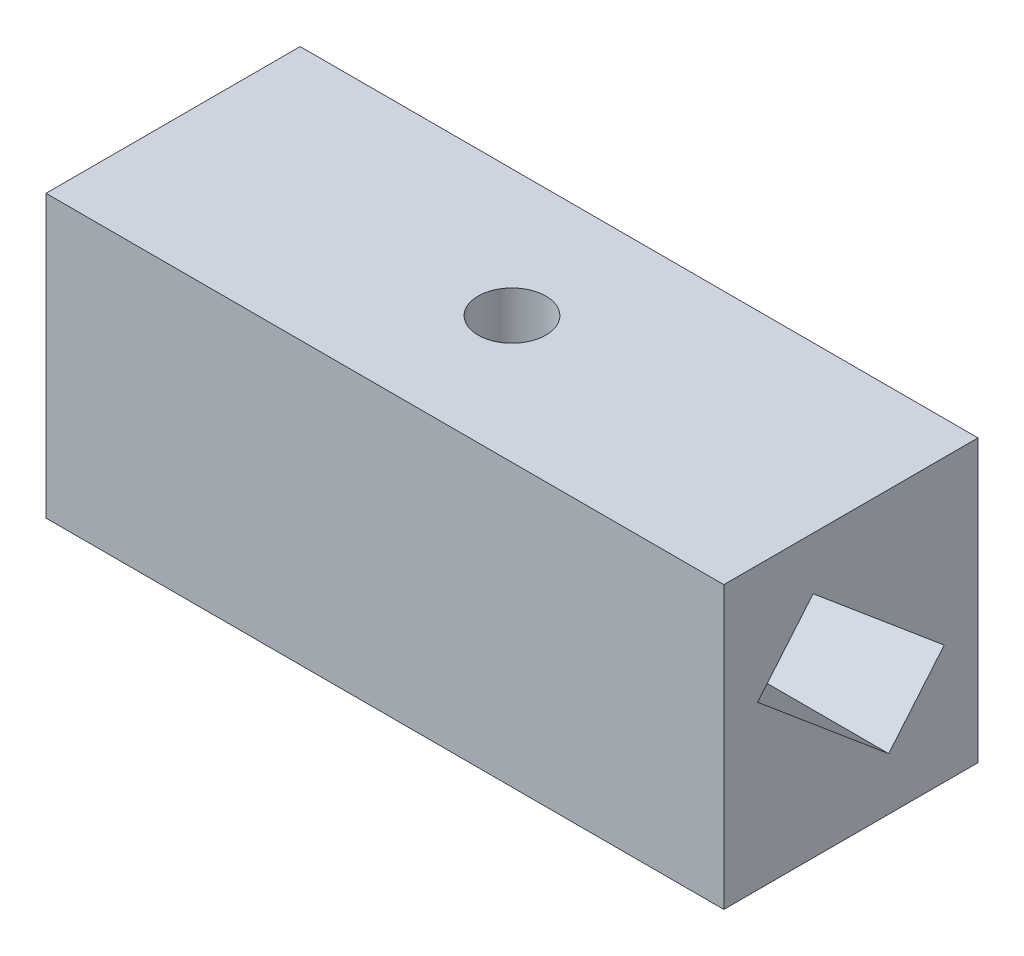
ISO-10303-21;
HEADER;
FILE_DESCRIPTION(('STEP AP214'),'2;1');
FILE_NAME('part.step','',(''),(''),'','','');
FILE_SCHEMA(('AUTOMOTIVE_DESIGN { 1 0 10303 214 1 1 1 1 }'));
ENDSEC;
DATA;
#1=APPLICATION_CONTEXT('core data for automotive mechanical design processes');
#2=APPLICATION_PROTOCOL_DEFINITION('international standard','automotive_design',2000,#1);
#3=PRODUCT_CONTEXT('',#1,'mechanical');
#4=PRODUCT('Part','Part','',(#3));
#5=PRODUCT_RELATED_PRODUCT_CATEGORY('part','',(#4));
#6=PRODUCT_DEFINITION_FORMATION('','',#4);
#7=PRODUCT_DEFINITION_CONTEXT('part definition',#1,'design');
#8=PRODUCT_DEFINITION('design','',#6,#7);
#9=PRODUCT_DEFINITION_SHAPE('','',#8);
#10=(LENGTH_UNIT() NAMED_UNIT(*) SI_UNIT(.MILLI.,.METRE.));
#11=(NAMED_UNIT(*) PLANE_ANGLE_UNIT() SI_UNIT($,.RADIAN.));
#12=(NAMED_UNIT(*) SI_UNIT($,.STERADIAN.) SOLID_ANGLE_UNIT());
#13=UNCERTAINTY_MEASURE_WITH_UNIT(LENGTH_MEASURE(1.E-05),#10,'distance_accuracy_value','');
#14=(GEOMETRIC_REPRESENTATION_CONTEXT(3) GLOBAL_UNCERTAINTY_ASSIGNED_CONTEXT((#13)) GLOBAL_UNIT_ASSIGNED_CONTEXT((#10,
#11,#12)) REPRESENTATION_CONTEXT('',''));
#15=CARTESIAN_POINT('',(0.,0.,0.));
#16=DIRECTION('',(0.,0.,1.));
#17=DIRECTION('',(1.,0.,0.));
#18=AXIS2_PLACEMENT_3D('',#15,#16,#17);
#19=CARTESIAN_POINT('',(40.,33.2,15.));
#20=DIRECTION('',(-1.,0.,0.));
#21=DIRECTION('',(0.,0.,1.));
#22=AXIS2_PLACEMENT_3D('',#19,#20,#21);
#23=PLANE('',#22);
#24=DIRECTION('',(0.,0.766044443118982,-0.642787609686534));
#25=VECTOR('',#24,1.);
#26=CARTESIAN_POINT('',(40.,14.0146718020728,-11.015265684903));
#27=LINE('',#26,#25);
#28=CARTESIAN_POINT('',(40.,6.20101848225919,-4.45883206610039));
#29=VERTEX_POINT('',#28);
#30=CARTESIAN_POINT('',(40.,14.0146718020728,-11.015265684903));
#31=VERTEX_POINT('',#30);
#32=EDGE_CURVE('E151',#29,#31,#27,.T.);
#33=ORIENTED_EDGE('',*,*,#32,.F.);
#34=DIRECTION('',(0.,-0.642787609686535,-0.766044443118982));
#35=VECTOR('',#34,1.);
#36=CARTESIAN_POINT('',(40.,6.20101848225919,-4.45883206610039));
#37=LINE('',#36,#35);
#38=CARTESIAN_POINT('',(40.,19.1853281979272,11.015265684903));
#39=VERTEX_POINT('',#38);
#40=EDGE_CURVE('E48',#39,#29,#37,.T.);
#41=ORIENTED_EDGE('',*,*,#40,.F.);
#42=DIRECTION('',(0.,-0.766044443118982,0.642787609686534));
#43=VECTOR('',#42,1.);
#44=CARTESIAN_POINT('',(40.,26.9989815177408,4.45883206610039));
#45=LINE('',#44,#43);
#46=CARTESIAN_POINT('',(40.,26.9989815177408,4.45883206610039));
#47=VERTEX_POINT('',#46);
#48=EDGE_CURVE('E142',#47,#39,#45,.T.);
#49=ORIENTED_EDGE('',*,*,#48,.F.);
#50=DIRECTION('',(0.,0.642787609686535,0.766044443118982));
#51=VECTOR('',#50,1.);
#52=CARTESIAN_POINT('',(40.,14.0146718020728,-11.015265684903));
#53=LINE('',#52,#51);
#54=EDGE_CURVE('E145',#31,#47,#53,.T.);
#55=ORIENTED_EDGE('',*,*,#54,.F.);
#56=EDGE_LOOP('',(#33,#41,#49,#55));
#57=FACE_BOUND('',#56,.T.);
#58=DIRECTION('',(0.,0.,-1.));
#59=VECTOR('',#58,1.);
#60=CARTESIAN_POINT('',(40.,0.,15.));
#61=LINE('',#60,#59);
#62=CARTESIAN_POINT('',(40.,0.,15.));
#63=VERTEX_POINT('',#62);
#64=CARTESIAN_POINT('',(40.,0.,-15.));
#65=VERTEX_POINT('',#64);
#66=EDGE_CURVE('E194',#63,#65,#61,.T.);
#67=ORIENTED_EDGE('',*,*,#66,.T.);
#68=DIRECTION('',(0.,-1.,0.));
#69=VECTOR('',#68,1.);
#70=CARTESIAN_POINT('',(40.,33.2,-15.));
#71=LINE('',#70,#69);
#72=CARTESIAN_POINT('',(40.,33.2,-15.));
#73=VERTEX_POINT('',#72);
#74=EDGE_CURVE('E11',#73,#65,#71,.T.);
#75=ORIENTED_EDGE('',*,*,#74,.F.);
#76=DIRECTION('',(0.,0.,-1.));
#77=VECTOR('',#76,1.);
#78=CARTESIAN_POINT('',(40.,33.2,15.));
#79=LINE('',#78,#77);
#80=CARTESIAN_POINT('',(40.,33.2,15.));
#81=VERTEX_POINT('',#80);
#82=EDGE_CURVE('E197',#81,#73,#79,.T.);
#83=ORIENTED_EDGE('',*,*,#82,.F.);
#84=DIRECTION('',(0.,-1.,0.));
#85=VECTOR('',#84,1.);
#86=CARTESIAN_POINT('',(40.,33.2,15.));
#87=LINE('',#86,#85);
#88=EDGE_CURVE('E207',#81,#63,#87,.T.);
#89=ORIENTED_EDGE('',*,*,#88,.T.);
#90=EDGE_LOOP('',(#67,#75,#83,#89));
#91=FACE_BOUND('',#90,.T.);
#92=ADVANCED_FACE('F34',(#57,#91),#23,.F.);
#93=CARTESIAN_POINT('',(-40.,33.2,-15.));
#94=DIRECTION('',(0.,0.,1.));
#95=DIRECTION('',(1.,0.,0.));
#96=AXIS2_PLACEMENT_3D('',#93,#94,#95);
#97=PLANE('',#96);
#98=DIRECTION('',(-1.,0.,0.));
#99=VECTOR('',#98,1.);
#100=CARTESIAN_POINT('',(-40.,0.,-15.));
#101=LINE('',#100,#99);
#102=CARTESIAN_POINT('',(-40.,0.,-15.));
#103=VERTEX_POINT('',#102);
#104=EDGE_CURVE('E210',#65,#103,#101,.T.);
#105=ORIENTED_EDGE('',*,*,#104,.T.);
#106=DIRECTION('',(0.,-1.,0.));
#107=VECTOR('',#106,1.);
#108=CARTESIAN_POINT('',(-40.,33.2,-15.));
#109=LINE('',#108,#107);
#110=CARTESIAN_POINT('',(-40.,33.2,-15.));
#111=VERTEX_POINT('',#110);
#112=EDGE_CURVE('E41',#111,#103,#109,.T.);
#113=ORIENTED_EDGE('',*,*,#112,.F.);
#114=DIRECTION('',(-1.,0.,0.));
#115=VECTOR('',#114,1.);
#116=CARTESIAN_POINT('',(-40.,33.2,-15.));
#117=LINE('',#116,#115);
#118=EDGE_CURVE('E200',#73,#111,#117,.T.);
#119=ORIENTED_EDGE('',*,*,#118,.F.);
#120=ORIENTED_EDGE('',*,*,#74,.T.);
#121=EDGE_LOOP('',(#105,#113,#119,#120));
#122=FACE_BOUND('',#121,.T.);
#123=ADVANCED_FACE('F240',(#122),#97,.F.);
#124=CARTESIAN_POINT('',(-40.,33.2,15.));
#125=DIRECTION('',(1.,0.,0.));
#126=DIRECTION('',(0.,0.,-1.));
#127=AXIS2_PLACEMENT_3D('',#124,#125,#126);
#128=PLANE('',#127);
#129=DIRECTION('',(0.,0.766044443118977,-0.642787609686541));
#130=VECTOR('',#129,1.);
#131=CARTESIAN_POINT('',(-40.,26.9989815177408,4.4588320661003));
#132=LINE('',#131,#130);
#133=CARTESIAN_POINT('',(-40.,19.1853281979273,11.015265684903));
#134=VERTEX_POINT('',#133);
#135=CARTESIAN_POINT('',(-40.,26.9989815177408,4.4588320661003));
#136=VERTEX_POINT('',#135);
#137=EDGE_CURVE('E175',#134,#136,#132,.T.);
#138=ORIENTED_EDGE('',*,*,#137,.F.);
#139=DIRECTION('',(0.,0.642787609686541,0.766044443118977));
#140=VECTOR('',#139,1.);
#141=CARTESIAN_POINT('',(-40.,6.20101848225915,-4.45883206610031));
#142=LINE('',#141,#140);
#143=CARTESIAN_POINT('',(-40.,6.20101848225915,-4.45883206610031));
#144=VERTEX_POINT('',#143);
#145=EDGE_CURVE('E56',#144,#134,#142,.T.);
#146=ORIENTED_EDGE('',*,*,#145,.F.);
#147=DIRECTION('',(0.,-0.766044443118977,0.642787609686541));
#148=VECTOR('',#147,1.);
#149=CARTESIAN_POINT('',(-40.,14.0146718020727,-11.015265684903));
#150=LINE('',#149,#148);
#151=CARTESIAN_POINT('',(-40.,14.0146718020727,-11.015265684903));
#152=VERTEX_POINT('',#151);
#153=EDGE_CURVE('E164',#152,#144,#150,.T.);
#154=ORIENTED_EDGE('',*,*,#153,.F.);
#155=DIRECTION('',(0.,-0.642787609686541,-0.766044443118977));
#156=VECTOR('',#155,1.);
#157=CARTESIAN_POINT('',(-40.,14.0146718020727,-11.015265684903));
#158=LINE('',#157,#156);
#159=EDGE_CURVE('E178',#136,#152,#158,.T.);
#160=ORIENTED_EDGE('',*,*,#159,.F.);
#161=EDGE_LOOP('',(#138,#146,#154,#160));
#162=FACE_BOUND('',#161,.T.);
#163=DIRECTION('',(0.,0.,1.));
#164=VECTOR('',#163,1.);
#165=CARTESIAN_POINT('',(-40.,0.,15.));
#166=LINE('',#165,#164);
#167=CARTESIAN_POINT('',(-40.,0.,15.));
#168=VERTEX_POINT('',#167);
#169=EDGE_CURVE('E212',#103,#168,#166,.T.);
#170=ORIENTED_EDGE('',*,*,#169,.T.);
#171=DIRECTION('',(0.,-1.,0.));
#172=VECTOR('',#171,1.);
#173=CARTESIAN_POINT('',(-40.,33.2,15.));
#174=LINE('',#173,#172);
#175=CARTESIAN_POINT('',(-40.,33.2,15.));
#176=VERTEX_POINT('',#175);
#177=EDGE_CURVE('E217',#176,#168,#174,.T.);
#178=ORIENTED_EDGE('',*,*,#177,.F.);
#179=DIRECTION('',(0.,0.,1.));
#180=VECTOR('',#179,1.);
#181=CARTESIAN_POINT('',(-40.,33.2,15.));
#182=LINE('',#181,#180);
#183=EDGE_CURVE('E203',#111,#176,#182,.T.);
#184=ORIENTED_EDGE('',*,*,#183,.F.);
#185=ORIENTED_EDGE('',*,*,#112,.T.);
#186=EDGE_LOOP('',(#170,#178,#184,#185));
#187=FACE_BOUND('',#186,.T.);
#188=ADVANCED_FACE('F224',(#162,#187),#128,.F.);
#189=CARTESIAN_POINT('',(-40.,33.2,15.));
#190=DIRECTION('',(0.,0.,-1.));
#191=DIRECTION('',(-1.,0.,0.));
#192=AXIS2_PLACEMENT_3D('',#189,#190,#191);
#193=PLANE('',#192);
#194=DIRECTION('',(1.,0.,0.));
#195=VECTOR('',#194,1.);
#196=CARTESIAN_POINT('',(-40.,0.,15.));
#197=LINE('',#196,#195);
#198=EDGE_CURVE('E201',#168,#63,#197,.T.);
#199=ORIENTED_EDGE('',*,*,#198,.T.);
#200=ORIENTED_EDGE('',*,*,#88,.F.);
#201=DIRECTION('',(1.,0.,0.));
#202=VECTOR('',#201,1.);
#203=CARTESIAN_POINT('',(-40.,33.2,15.));
#204=LINE('',#203,#202);
#205=EDGE_CURVE('E205',#176,#81,#204,.T.);
#206=ORIENTED_EDGE('',*,*,#205,.F.);
#207=ORIENTED_EDGE('',*,*,#177,.T.);
#208=EDGE_LOOP('',(#199,#200,#206,#207));
#209=FACE_BOUND('',#208,.T.);
#210=ADVANCED_FACE('F233',(#209),#193,.F.);
#211=CARTESIAN_POINT('',(0.,33.2,0.));
#212=DIRECTION('',(0.,-1.,0.));
#213=DIRECTION('',(0.,0.,-1.));
#214=AXIS2_PLACEMENT_3D('',#211,#212,#213);
#215=PLANE('',#214);
#216=CARTESIAN_POINT('',(0.,33.2,0.));
#217=DIRECTION('',(0.,1.,0.));
#218=DIRECTION('',(0.,0.,1.));
#219=AXIS2_PLACEMENT_3D('',#216,#217,#218);
#220=CIRCLE('',#219,4.);
#221=CARTESIAN_POINT('',(0.,33.2,4.));
#222=VERTEX_POINT('',#221);
#223=EDGE_CURVE('E185',#222,#222,#220,.T.);
#224=ORIENTED_EDGE('',*,*,#223,.F.);
#225=EDGE_LOOP('',(#224));
#226=FACE_BOUND('',#225,.T.);
#227=ORIENTED_EDGE('',*,*,#82,.T.);
#228=ORIENTED_EDGE('',*,*,#118,.T.);
#229=ORIENTED_EDGE('',*,*,#183,.T.);
#230=ORIENTED_EDGE('',*,*,#205,.T.);
#231=EDGE_LOOP('',(#227,#228,#229,#230));
#232=FACE_BOUND('',#231,.T.);
#233=ADVANCED_FACE('F239',(#226,#232),#215,.F.);
#234=CARTESIAN_POINT('',(0.,0.,0.));
#235=DIRECTION('',(0.,-1.,0.));
#236=DIRECTION('',(0.,0.,-1.));
#237=AXIS2_PLACEMENT_3D('',#234,#235,#236);
#238=PLANE('',#237);
#239=CARTESIAN_POINT('',(0.,0.,0.));
#240=DIRECTION('',(0.,1.,0.));
#241=DIRECTION('',(0.,0.,1.));
#242=AXIS2_PLACEMENT_3D('',#239,#240,#241);
#243=CIRCLE('',#242,4.);
#244=CARTESIAN_POINT('',(0.,0.,4.));
#245=VERTEX_POINT('',#244);
#246=EDGE_CURVE('E191',#245,#245,#243,.T.);
#247=ORIENTED_EDGE('',*,*,#246,.T.);
#248=EDGE_LOOP('',(#247));
#249=FACE_BOUND('',#248,.T.);
#250=ORIENTED_EDGE('',*,*,#66,.F.);
#251=ORIENTED_EDGE('',*,*,#198,.F.);
#252=ORIENTED_EDGE('',*,*,#169,.F.);
#253=ORIENTED_EDGE('',*,*,#104,.F.);
#254=EDGE_LOOP('',(#250,#251,#252,#253));
#255=FACE_BOUND('',#254,.T.);
#256=ADVANCED_FACE('F230',(#249,#255),#238,.T.);
#257=CARTESIAN_POINT('',(0.,0.,0.));
#258=DIRECTION('',(0.,1.,0.));
#259=DIRECTION('',(0.,0.,1.));
#260=AXIS2_PLACEMENT_3D('',#257,#258,#259);
#261=CYLINDRICAL_SURFACE('',#260,4.);
#262=CARTESIAN_POINT('',(0.,0.,4.));
#263=CARTESIAN_POINT('',(0.,0.345833333333333,4.));
#264=CARTESIAN_POINT('',(0.,0.691666666666667,4.));
#265=CARTESIAN_POINT('',(0.,1.38333333333333,4.));
#266=CARTESIAN_POINT('',(0.,1.72916666666667,4.));
#267=CARTESIAN_POINT('',(0.,2.42083333333333,4.));
#268=CARTESIAN_POINT('',(0.,2.76666666666667,4.));
#269=CARTESIAN_POINT('',(0.,3.45833333333333,4.));
#270=CARTESIAN_POINT('',(0.,3.80416666666667,4.));
#271=CARTESIAN_POINT('',(0.,4.49583333333333,4.));
#272=CARTESIAN_POINT('',(0.,4.84166666666667,4.));
#273=CARTESIAN_POINT('',(0.,5.53333333333333,4.));
#274=CARTESIAN_POINT('',(0.,5.87916666666667,4.));
#275=CARTESIAN_POINT('',(0.,6.57083333333333,4.));
#276=CARTESIAN_POINT('',(0.,6.91666666666667,4.));
#277=CARTESIAN_POINT('',(0.,7.60833333333333,4.));
#278=CARTESIAN_POINT('',(0.,7.95416666666667,4.));
#279=CARTESIAN_POINT('',(0.,8.64583333333333,4.));
#280=CARTESIAN_POINT('',(0.,8.99166666666667,4.));
#281=CARTESIAN_POINT('',(0.,9.68333333333333,4.));
#282=CARTESIAN_POINT('',(0.,10.0291666666667,4.));
#283=CARTESIAN_POINT('',(0.,10.7208333333333,4.));
#284=CARTESIAN_POINT('',(0.,11.0666666666667,4.));
#285=CARTESIAN_POINT('',(0.,11.7583333333333,4.));
#286=CARTESIAN_POINT('',(0.,12.1041666666667,4.));
#287=CARTESIAN_POINT('',(0.,12.7958333333333,4.));
#288=CARTESIAN_POINT('',(0.,13.1416666666667,4.));
#289=CARTESIAN_POINT('',(0.,13.8333333333333,4.));
#290=CARTESIAN_POINT('',(0.,14.1791666666667,4.));
#291=CARTESIAN_POINT('',(0.,14.8708333333333,4.));
#292=CARTESIAN_POINT('',(0.,15.2166666666667,4.));
#293=CARTESIAN_POINT('',(0.,15.9083333333333,4.));
#294=CARTESIAN_POINT('',(0.,16.2541666666667,4.));
#295=CARTESIAN_POINT('',(0.,16.9458333333333,4.));
#296=CARTESIAN_POINT('',(0.,17.2916666666667,4.));
#297=CARTESIAN_POINT('',(0.,17.9833333333333,4.));
#298=CARTESIAN_POINT('',(0.,18.3291666666667,4.));
#299=CARTESIAN_POINT('',(0.,19.0208333333333,4.));
#300=CARTESIAN_POINT('',(0.,19.3666666666667,4.));
#301=CARTESIAN_POINT('',(0.,20.0583333333333,4.));
#302=CARTESIAN_POINT('',(0.,20.4041666666667,4.));
#303=CARTESIAN_POINT('',(0.,21.0958333333333,4.));
#304=CARTESIAN_POINT('',(0.,21.4416666666667,4.));
#305=CARTESIAN_POINT('',(0.,22.1333333333333,4.));
#306=CARTESIAN_POINT('',(0.,22.4791666666667,4.));
#307=CARTESIAN_POINT('',(0.,23.1708333333333,4.));
#308=CARTESIAN_POINT('',(0.,23.5166666666667,4.));
#309=CARTESIAN_POINT('',(0.,24.2083333333333,4.));
#310=CARTESIAN_POINT('',(0.,24.5541666666667,4.));
#311=CARTESIAN_POINT('',(0.,25.2458333333333,4.));
#312=CARTESIAN_POINT('',(0.,25.5916666666667,4.));
#313=CARTESIAN_POINT('',(0.,26.2833333333333,4.));
#314=CARTESIAN_POINT('',(0.,26.6291666666667,4.));
#315=CARTESIAN_POINT('',(0.,27.3208333333333,4.));
#316=CARTESIAN_POINT('',(0.,27.6666666666667,4.));
#317=CARTESIAN_POINT('',(0.,28.3583333333333,4.));
#318=CARTESIAN_POINT('',(0.,28.7041666666667,4.));
#319=CARTESIAN_POINT('',(0.,29.3958333333333,4.));
#320=CARTESIAN_POINT('',(0.,29.7416666666667,4.));
#321=CARTESIAN_POINT('',(0.,30.4333333333333,4.));
#322=CARTESIAN_POINT('',(0.,30.7791666666667,4.));
#323=CARTESIAN_POINT('',(0.,31.4708333333333,4.));
#324=CARTESIAN_POINT('',(0.,31.8166666666667,4.));
#325=CARTESIAN_POINT('',(0.,32.5083333333333,4.));
#326=CARTESIAN_POINT('',(0.,32.8541666666667,4.));
#327=CARTESIAN_POINT('',(0.,33.2,4.));
#328=B_SPLINE_CURVE_WITH_KNOTS('',3,(#262,#263,#264,#265,#266,#267,#268,#269,#270,#271,#272,
#273,#274,#275,#276,#277,#278,#279,#280,#281,#282,#283,#284,#285,#286,#287,#288,#289,#290,#291,
#292,#293,#294,#295,#296,#297,#298,#299,#300,#301,#302,#303,#304,#305,#306,#307,#308,#309,#310,
#311,#312,#313,#314,#315,#316,#317,#318,#319,#320,#321,#322,#323,#324,#325,#326,#327),
.UNSPECIFIED.,.F.,.F.,(4,2,2,2,2,2,2,2,2,2,2,2,2,2,2,2,2,2,2,2,2,2,2,2,2,2,2,2,2,2,2,2,4),(0.,
1.0375,2.075,3.1125,4.15,5.1875,6.225,7.2625,8.3,9.3375,10.375,11.4125,12.45,13.4875,14.525,
15.5625,16.6,17.6375,18.675,19.7125,20.75,21.7875,22.825,23.8625,24.9,25.9375,26.975,28.0125,
29.05,30.0875,31.125,32.1625,33.2),.UNSPECIFIED.);
#329=EDGE_CURVE('BSEAM254',#245,#222,#328,.T.);
#330=ORIENTED_EDGE('',*,*,#246,.F.);
#331=ORIENTED_EDGE('',*,*,#223,.T.);
#332=ORIENTED_EDGE('',*,*,#329,.T.);
#333=ORIENTED_EDGE('',*,*,#329,.F.);
#334=EDGE_LOOP('',(#330,#332,#331,#333));
#335=FACE_BOUND('',#334,.T.);
#336=ADVANCED_FACE('F254',(#335),#261,.F.);
#337=CARTESIAN_POINT('',(-10.,6.20101848225915,-4.45883206610031));
#338=DIRECTION('',(0.,-0.766044443118977,0.642787609686541));
#339=DIRECTION('',(0.,-0.642787609686541,-0.766044443118977));
#340=AXIS2_PLACEMENT_3D('',#337,#338,#339);
#341=PLANE('',#340);
#342=ORIENTED_EDGE('',*,*,#145,.T.);
#343=DIRECTION('',(-1.,0.,0.));
#344=VECTOR('',#343,1.);
#345=CARTESIAN_POINT('',(-10.,19.1853281979273,11.015265684903));
#346=LINE('',#345,#344);
#347=CARTESIAN_POINT('',(-10.,19.1853281979273,11.015265684903));
#348=VERTEX_POINT('',#347);
#349=EDGE_CURVE('E173',#348,#134,#346,.T.);
#350=ORIENTED_EDGE('',*,*,#349,.F.);
#351=DIRECTION('',(0.,0.642787609686541,0.766044443118977));
#352=VECTOR('',#351,1.);
#353=CARTESIAN_POINT('',(-10.,6.20101848225915,-4.45883206610031));
#354=LINE('',#353,#352);
#355=CARTESIAN_POINT('',(-10.,6.20101848225915,-4.45883206610031));
#356=VERTEX_POINT('',#355);
#357=EDGE_CURVE('E160',#356,#348,#354,.T.);
#358=ORIENTED_EDGE('',*,*,#357,.F.);
#359=DIRECTION('',(-1.,0.,0.));
#360=VECTOR('',#359,1.);
#361=CARTESIAN_POINT('',(-10.,6.20101848225915,-4.45883206610031));
#362=LINE('',#361,#360);
#363=EDGE_CURVE('E183',#356,#144,#362,.T.);
#364=ORIENTED_EDGE('',*,*,#363,.T.);
#365=EDGE_LOOP('',(#342,#350,#358,#364));
#366=FACE_BOUND('',#365,.T.);
#367=ADVANCED_FACE('F261',(#366),#341,.F.);
#368=CARTESIAN_POINT('',(-10.,14.0146718020727,-11.015265684903));
#369=DIRECTION('',(0.,-0.642787609686541,-0.766044443118977));
#370=DIRECTION('',(0.,0.766044443118977,-0.642787609686541));
#371=AXIS2_PLACEMENT_3D('',#368,#369,#370);
#372=PLANE('',#371);
#373=ORIENTED_EDGE('',*,*,#153,.T.);
#374=ORIENTED_EDGE('',*,*,#363,.F.);
#375=DIRECTION('',(0.,-0.766044443118977,0.642787609686541));
#376=VECTOR('',#375,1.);
#377=CARTESIAN_POINT('',(-10.,14.0146718020727,-11.015265684903));
#378=LINE('',#377,#376);
#379=CARTESIAN_POINT('',(-10.,14.0146718020727,-11.015265684903));
#380=VERTEX_POINT('',#379);
#381=EDGE_CURVE('E170',#380,#356,#378,.T.);
#382=ORIENTED_EDGE('',*,*,#381,.F.);
#383=DIRECTION('',(-1.,0.,0.));
#384=VECTOR('',#383,1.);
#385=CARTESIAN_POINT('',(-10.,14.0146718020727,-11.015265684903));
#386=LINE('',#385,#384);
#387=EDGE_CURVE('E186',#380,#152,#386,.T.);
#388=ORIENTED_EDGE('',*,*,#387,.T.);
#389=EDGE_LOOP('',(#373,#374,#382,#388));
#390=FACE_BOUND('',#389,.T.);
#391=ADVANCED_FACE('F265',(#390),#372,.F.);
#392=CARTESIAN_POINT('',(-10.,14.0146718020727,-11.015265684903));
#393=DIRECTION('',(0.,0.766044443118977,-0.642787609686541));
#394=DIRECTION('',(0.,0.642787609686541,0.766044443118977));
#395=AXIS2_PLACEMENT_3D('',#392,#393,#394);
#396=PLANE('',#395);
#397=ORIENTED_EDGE('',*,*,#159,.T.);
#398=ORIENTED_EDGE('',*,*,#387,.F.);
#399=DIRECTION('',(0.,-0.642787609686541,-0.766044443118977));
#400=VECTOR('',#399,1.);
#401=CARTESIAN_POINT('',(-10.,14.0146718020727,-11.015265684903));
#402=LINE('',#401,#400);
#403=CARTESIAN_POINT('',(-10.,26.9989815177408,4.4588320661003));
#404=VERTEX_POINT('',#403);
#405=EDGE_CURVE('E167',#404,#380,#402,.T.);
#406=ORIENTED_EDGE('',*,*,#405,.F.);
#407=DIRECTION('',(-1.,0.,0.));
#408=VECTOR('',#407,1.);
#409=CARTESIAN_POINT('',(-10.,26.9989815177408,4.4588320661003));
#410=LINE('',#409,#408);
#411=EDGE_CURVE('E188',#404,#136,#410,.T.);
#412=ORIENTED_EDGE('',*,*,#411,.T.);
#413=EDGE_LOOP('',(#397,#398,#406,#412));
#414=FACE_BOUND('',#413,.T.);
#415=ADVANCED_FACE('F270',(#414),#396,.F.);
#416=CARTESIAN_POINT('',(-10.,26.9989815177408,4.4588320661003));
#417=DIRECTION('',(0.,0.642787609686541,0.766044443118977));
#418=DIRECTION('',(0.,-0.766044443118977,0.642787609686541));
#419=AXIS2_PLACEMENT_3D('',#416,#417,#418);
#420=PLANE('',#419);
#421=ORIENTED_EDGE('',*,*,#137,.T.);
#422=ORIENTED_EDGE('',*,*,#411,.F.);
#423=DIRECTION('',(0.,0.766044443118977,-0.642787609686541));
#424=VECTOR('',#423,1.);
#425=CARTESIAN_POINT('',(-10.,26.9989815177408,4.4588320661003));
#426=LINE('',#425,#424);
#427=EDGE_CURVE('E163',#348,#404,#426,.T.);
#428=ORIENTED_EDGE('',*,*,#427,.F.);
#429=ORIENTED_EDGE('',*,*,#349,.T.);
#430=EDGE_LOOP('',(#421,#422,#428,#429));
#431=FACE_BOUND('',#430,.T.);
#432=ADVANCED_FACE('F266',(#431),#420,.F.);
#433=CARTESIAN_POINT('',(-10.,0.,0.));
#434=DIRECTION('',(1.,0.,0.));
#435=DIRECTION('',(0.,0.,-1.));
#436=AXIS2_PLACEMENT_3D('',#433,#434,#435);
#437=PLANE('',#436);
#438=ORIENTED_EDGE('',*,*,#357,.T.);
#439=ORIENTED_EDGE('',*,*,#427,.T.);
#440=ORIENTED_EDGE('',*,*,#405,.T.);
#441=ORIENTED_EDGE('',*,*,#381,.T.);
#442=EDGE_LOOP('',(#438,#439,#440,#441));
#443=FACE_BOUND('',#442,.T.);
#444=ADVANCED_FACE('F269',(#443),#437,.F.);
#445=CARTESIAN_POINT('',(10.,6.20101848225919,-4.45883206610039));
#446=DIRECTION('',(0.,-0.766044443118982,0.642787609686535));
#447=DIRECTION('',(0.,-0.642787609686535,-0.766044443118982));
#448=AXIS2_PLACEMENT_3D('',#445,#446,#447);
#449=PLANE('',#448);
#450=ORIENTED_EDGE('',*,*,#40,.T.);
#451=DIRECTION('',(1.,0.,0.));
#452=VECTOR('',#451,1.);
#453=CARTESIAN_POINT('',(10.,6.20101848225919,-4.45883206610039));
#454=LINE('',#453,#452);
#455=CARTESIAN_POINT('',(10.,6.20101848225919,-4.45883206610039));
#456=VERTEX_POINT('',#455);
#457=EDGE_CURVE('E120',#456,#29,#454,.T.);
#458=ORIENTED_EDGE('',*,*,#457,.F.);
#459=DIRECTION('',(0.,-0.642787609686535,-0.766044443118982));
#460=VECTOR('',#459,1.);
#461=CARTESIAN_POINT('',(10.,6.20101848225919,-4.45883206610039));
#462=LINE('',#461,#460);
#463=CARTESIAN_POINT('',(10.,19.1853281979272,11.015265684903));
#464=VERTEX_POINT('',#463);
#465=EDGE_CURVE('E124',#464,#456,#462,.T.);
#466=ORIENTED_EDGE('',*,*,#465,.F.);
#467=DIRECTION('',(1.,0.,0.));
#468=VECTOR('',#467,1.);
#469=CARTESIAN_POINT('',(10.,19.1853281979272,11.015265684903));
#470=LINE('',#469,#468);
#471=EDGE_CURVE('E155',#464,#39,#470,.T.);
#472=ORIENTED_EDGE('',*,*,#471,.T.);
#473=EDGE_LOOP('',(#450,#458,#466,#472));
#474=FACE_BOUND('',#473,.T.);
#475=ADVANCED_FACE('F122',(#474),#449,.F.);
#476=CARTESIAN_POINT('',(10.,26.9989815177408,4.45883206610039));
#477=DIRECTION('',(0.,0.642787609686534,0.766044443118982));
#478=DIRECTION('',(0.,-0.766044443118982,0.642787609686534));
#479=AXIS2_PLACEMENT_3D('',#476,#477,#478);
#480=PLANE('',#479);
#481=ORIENTED_EDGE('',*,*,#48,.T.);
#482=ORIENTED_EDGE('',*,*,#471,.F.);
#483=DIRECTION('',(0.,-0.766044443118982,0.642787609686534));
#484=VECTOR('',#483,1.);
#485=CARTESIAN_POINT('',(10.,26.9989815177408,4.45883206610039));
#486=LINE('',#485,#484);
#487=CARTESIAN_POINT('',(10.,26.9989815177408,4.45883206610039));
#488=VERTEX_POINT('',#487);
#489=EDGE_CURVE('E130',#488,#464,#486,.T.);
#490=ORIENTED_EDGE('',*,*,#489,.F.);
#491=DIRECTION('',(1.,0.,0.));
#492=VECTOR('',#491,1.);
#493=CARTESIAN_POINT('',(10.,26.9989815177408,4.45883206610039));
#494=LINE('',#493,#492);
#495=EDGE_CURVE('E157',#488,#47,#494,.T.);
#496=ORIENTED_EDGE('',*,*,#495,.T.);
#497=EDGE_LOOP('',(#481,#482,#490,#496));
#498=FACE_BOUND('',#497,.T.);
#499=ADVANCED_FACE('F283',(#498),#480,.F.);
#500=CARTESIAN_POINT('',(10.,14.0146718020728,-11.015265684903));
#501=DIRECTION('',(0.,0.766044443118982,-0.642787609686535));
#502=DIRECTION('',(0.,0.642787609686535,0.766044443118982));
#503=AXIS2_PLACEMENT_3D('',#500,#501,#502);
#504=PLANE('',#503);
#505=ORIENTED_EDGE('',*,*,#54,.T.);
#506=ORIENTED_EDGE('',*,*,#495,.F.);
#507=DIRECTION('',(0.,0.642787609686535,0.766044443118982));
#508=VECTOR('',#507,1.);
#509=CARTESIAN_POINT('',(10.,14.0146718020728,-11.015265684903));
#510=LINE('',#509,#508);
#511=CARTESIAN_POINT('',(10.,14.0146718020728,-11.015265684903));
#512=VERTEX_POINT('',#511);
#513=EDGE_CURVE('E138',#512,#488,#510,.T.);
#514=ORIENTED_EDGE('',*,*,#513,.F.);
#515=DIRECTION('',(1.,0.,0.));
#516=VECTOR('',#515,1.);
#517=CARTESIAN_POINT('',(10.,14.0146718020728,-11.015265684903));
#518=LINE('',#517,#516);
#519=EDGE_CURVE('E129',#512,#31,#518,.T.);
#520=ORIENTED_EDGE('',*,*,#519,.T.);
#521=EDGE_LOOP('',(#505,#506,#514,#520));
#522=FACE_BOUND('',#521,.T.);
#523=ADVANCED_FACE('F286',(#522),#504,.F.);
#524=CARTESIAN_POINT('',(10.,14.0146718020728,-11.015265684903));
#525=DIRECTION('',(0.,-0.642787609686534,-0.766044443118982));
#526=DIRECTION('',(0.,0.766044443118982,-0.642787609686534));
#527=AXIS2_PLACEMENT_3D('',#524,#525,#526);
#528=PLANE('',#527);
#529=ORIENTED_EDGE('',*,*,#32,.T.);
#530=ORIENTED_EDGE('',*,*,#519,.F.);
#531=DIRECTION('',(0.,0.766044443118982,-0.642787609686534));
#532=VECTOR('',#531,1.);
#533=CARTESIAN_POINT('',(10.,14.0146718020728,-11.015265684903));
#534=LINE('',#533,#532);
#535=EDGE_CURVE('E133',#456,#512,#534,.T.);
#536=ORIENTED_EDGE('',*,*,#535,.F.);
#537=ORIENTED_EDGE('',*,*,#457,.T.);
#538=EDGE_LOOP('',(#529,#530,#536,#537));
#539=FACE_BOUND('',#538,.T.);
#540=ADVANCED_FACE('F134',(#539),#528,.F.);
#541=CARTESIAN_POINT('',(10.,0.,0.));
#542=DIRECTION('',(1.,0.,0.));
#543=DIRECTION('',(0.,0.,-1.));
#544=AXIS2_PLACEMENT_3D('',#541,#542,#543);
#545=PLANE('',#544);
#546=ORIENTED_EDGE('',*,*,#465,.T.);
#547=ORIENTED_EDGE('',*,*,#535,.T.);
#548=ORIENTED_EDGE('',*,*,#513,.T.);
#549=ORIENTED_EDGE('',*,*,#489,.T.);
#550=EDGE_LOOP('',(#546,#547,#548,#549));
#551=FACE_BOUND('',#550,.T.);
#552=ADVANCED_FACE('F140',(#551),#545,.T.);
#553=CLOSED_SHELL('',(#92,#123,#188,#210,#233,#256,#336,#367,#391,#415,#432,#444,#475,#499,#523,
#540,#552));
#554=MANIFOLD_SOLID_BREP('B2',#553);
#555=ADVANCED_BREP_SHAPE_REPRESENTATION('',(#18,#554),#14);
#556=SHAPE_DEFINITION_REPRESENTATION(#9,#555);
ENDSEC;
END-ISO-10303-21;
